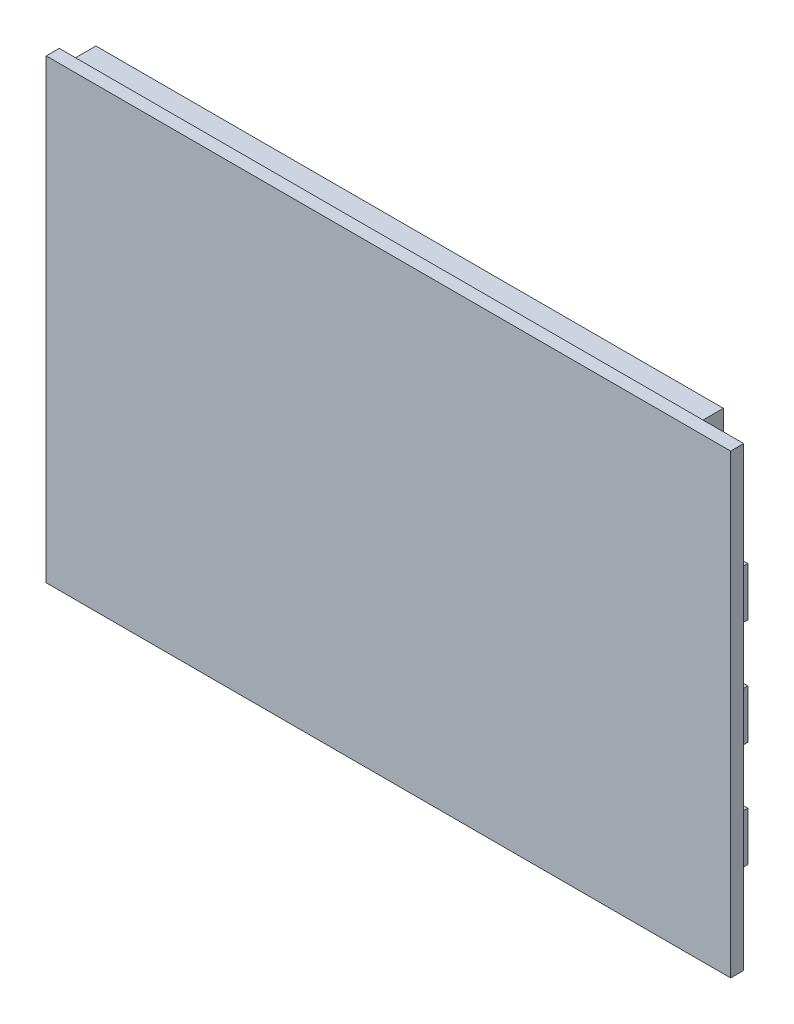
ISO-10303-21;
HEADER;
FILE_DESCRIPTION(('STEP AP214'),'2;1');
FILE_NAME('part.step','',(''),(''),'','','');
FILE_SCHEMA(('AUTOMOTIVE_DESIGN { 1 0 10303 214 1 1 1 1 }'));
ENDSEC;
DATA;
#1=APPLICATION_CONTEXT('core data for automotive mechanical design processes');
#2=APPLICATION_PROTOCOL_DEFINITION('international standard','automotive_design',2000,#1);
#3=PRODUCT_CONTEXT('',#1,'mechanical');
#4=PRODUCT('Part','Part','',(#3));
#5=PRODUCT_RELATED_PRODUCT_CATEGORY('part','',(#4));
#6=PRODUCT_DEFINITION_FORMATION('','',#4);
#7=PRODUCT_DEFINITION_CONTEXT('part definition',#1,'design');
#8=PRODUCT_DEFINITION('design','',#6,#7);
#9=PRODUCT_DEFINITION_SHAPE('','',#8);
#10=(LENGTH_UNIT() NAMED_UNIT(*) SI_UNIT(.MILLI.,.METRE.));
#11=(NAMED_UNIT(*) PLANE_ANGLE_UNIT() SI_UNIT($,.RADIAN.));
#12=(NAMED_UNIT(*) SI_UNIT($,.STERADIAN.) SOLID_ANGLE_UNIT());
#13=UNCERTAINTY_MEASURE_WITH_UNIT(LENGTH_MEASURE(1.E-05),#10,'distance_accuracy_value','');
#14=(GEOMETRIC_REPRESENTATION_CONTEXT(3) GLOBAL_UNCERTAINTY_ASSIGNED_CONTEXT((#13)) GLOBAL_UNIT_ASSIGNED_CONTEXT((#10,
#11,#12)) REPRESENTATION_CONTEXT('',''));
#15=CARTESIAN_POINT('',(0.,0.,0.));
#16=DIRECTION('',(0.,0.,1.));
#17=DIRECTION('',(1.,0.,0.));
#18=AXIS2_PLACEMENT_3D('',#15,#16,#17);
#19=CARTESIAN_POINT('',(0.,0.,0.));
#20=DIRECTION('',(0.,0.,1.));
#21=DIRECTION('',(1.,0.,0.));
#22=AXIS2_PLACEMENT_3D('',#19,#20,#21);
#23=PLANE('',#22);
#24=DIRECTION('',(0.,1.,0.));
#25=VECTOR('',#24,1.);
#26=CARTESIAN_POINT('',(79.,36.,0.));
#27=LINE('',#26,#25);
#28=CARTESIAN_POINT('',(79.,36.,0.));
#29=VERTEX_POINT('',#28);
#30=CARTESIAN_POINT('',(79.,42.,0.));
#31=VERTEX_POINT('',#30);
#32=EDGE_CURVE('E192',#29,#31,#27,.T.);
#33=ORIENTED_EDGE('',*,*,#32,.F.);
#34=DIRECTION('',(-1.,0.,0.));
#35=VECTOR('',#34,1.);
#36=CARTESIAN_POINT('',(79.,36.,0.));
#37=LINE('',#36,#35);
#38=CARTESIAN_POINT('',(83.,36.,0.));
#39=VERTEX_POINT('',#38);
#40=EDGE_CURVE('E205',#39,#29,#37,.T.);
#41=ORIENTED_EDGE('',*,*,#40,.F.);
#42=DIRECTION('',(0.,-1.,0.));
#43=VECTOR('',#42,1.);
#44=CARTESIAN_POINT('',(83.,36.,0.));
#45=LINE('',#44,#43);
#46=CARTESIAN_POINT('',(83.,42.,0.));
#47=VERTEX_POINT('',#46);
#48=EDGE_CURVE('E214',#47,#39,#45,.T.);
#49=ORIENTED_EDGE('',*,*,#48,.F.);
#50=DIRECTION('',(1.,0.,0.));
#51=VECTOR('',#50,1.);
#52=CARTESIAN_POINT('',(79.,42.,0.));
#53=LINE('',#52,#51);
#54=EDGE_CURVE('E195',#31,#47,#53,.T.);
#55=ORIENTED_EDGE('',*,*,#54,.F.);
#56=EDGE_LOOP('',(#33,#41,#49,#55));
#57=FACE_BOUND('',#56,.T.);
#58=DIRECTION('',(0.,-1.,0.));
#59=VECTOR('',#58,1.);
#60=CARTESIAN_POINT('',(78.,55.,0.));
#61=LINE('',#60,#59);
#62=CARTESIAN_POINT('',(78.,55.,0.));
#63=VERTEX_POINT('',#62);
#64=CARTESIAN_POINT('',(78.,1.,0.));
#65=VERTEX_POINT('',#64);
#66=EDGE_CURVE('E262',#63,#65,#61,.T.);
#67=ORIENTED_EDGE('',*,*,#66,.F.);
#68=DIRECTION('',(1.,0.,0.));
#69=VECTOR('',#68,1.);
#70=CARTESIAN_POINT('',(78.,55.,0.));
#71=LINE('',#70,#69);
#72=CARTESIAN_POINT('',(1.,55.,0.));
#73=VERTEX_POINT('',#72);
#74=EDGE_CURVE('E267',#73,#63,#71,.T.);
#75=ORIENTED_EDGE('',*,*,#74,.F.);
#76=DIRECTION('',(0.,1.,0.));
#77=VECTOR('',#76,1.);
#78=CARTESIAN_POINT('',(1.,55.,0.));
#79=LINE('',#78,#77);
#80=CARTESIAN_POINT('',(1.,1.,0.));
#81=VERTEX_POINT('',#80);
#82=EDGE_CURVE('E279',#81,#73,#79,.T.);
#83=ORIENTED_EDGE('',*,*,#82,.F.);
#84=DIRECTION('',(-1.,0.,0.));
#85=VECTOR('',#84,1.);
#86=CARTESIAN_POINT('',(78.,1.,0.));
#87=LINE('',#86,#85);
#88=EDGE_CURVE('E276',#65,#81,#87,.T.);
#89=ORIENTED_EDGE('',*,*,#88,.F.);
#90=EDGE_LOOP('',(#67,#75,#83,#89));
#91=FACE_BOUND('',#90,.T.);
#92=DIRECTION('',(1.,0.,0.));
#93=VECTOR('',#92,1.);
#94=CARTESIAN_POINT('',(0.,56.,0.));
#95=LINE('',#94,#93);
#96=CARTESIAN_POINT('',(0.,56.,0.));
#97=VERTEX_POINT('',#96);
#98=CARTESIAN_POINT('',(84.,56.,0.));
#99=VERTEX_POINT('',#98);
#100=EDGE_CURVE('E295',#97,#99,#95,.T.);
#101=ORIENTED_EDGE('',*,*,#100,.T.);
#102=DIRECTION('',(0.,1.,0.));
#103=VECTOR('',#102,1.);
#104=CARTESIAN_POINT('',(84.,0.,0.));
#105=LINE('',#104,#103);
#106=CARTESIAN_POINT('',(84.,0.,0.));
#107=VERTEX_POINT('',#106);
#108=EDGE_CURVE('E309',#107,#99,#105,.T.);
#109=ORIENTED_EDGE('',*,*,#108,.F.);
#110=DIRECTION('',(1.,0.,0.));
#111=VECTOR('',#110,1.);
#112=CARTESIAN_POINT('',(0.,0.,0.));
#113=LINE('',#112,#111);
#114=CARTESIAN_POINT('',(0.,0.,0.));
#115=VERTEX_POINT('',#114);
#116=EDGE_CURVE('E312',#115,#107,#113,.T.);
#117=ORIENTED_EDGE('',*,*,#116,.F.);
#118=DIRECTION('',(0.,1.,0.));
#119=VECTOR('',#118,1.);
#120=CARTESIAN_POINT('',(0.,0.,0.));
#121=LINE('',#120,#119);
#122=EDGE_CURVE('E300',#115,#97,#121,.T.);
#123=ORIENTED_EDGE('',*,*,#122,.T.);
#124=EDGE_LOOP('',(#101,#109,#117,#123));
#125=FACE_BOUND('',#124,.T.);
#126=DIRECTION('',(0.,-1.,0.));
#127=VECTOR('',#126,1.);
#128=CARTESIAN_POINT('',(83.,29.,0.));
#129=LINE('',#128,#127);
#130=CARTESIAN_POINT('',(83.,29.,0.));
#131=VERTEX_POINT('',#130);
#132=CARTESIAN_POINT('',(83.,23.,0.));
#133=VERTEX_POINT('',#132);
#134=EDGE_CURVE('E230',#131,#133,#129,.T.);
#135=ORIENTED_EDGE('',*,*,#134,.F.);
#136=DIRECTION('',(-1.,0.,0.));
#137=VECTOR('',#136,1.);
#138=CARTESIAN_POINT('',(83.,29.,0.));
#139=LINE('',#138,#137);
#140=CARTESIAN_POINT('',(79.,29.,0.));
#141=VERTEX_POINT('',#140);
#142=EDGE_CURVE('E235',#131,#141,#139,.T.);
#143=ORIENTED_EDGE('',*,*,#142,.T.);
#144=DIRECTION('',(0.,-1.,0.));
#145=VECTOR('',#144,1.);
#146=CARTESIAN_POINT('',(79.,29.,0.));
#147=LINE('',#146,#145);
#148=CARTESIAN_POINT('',(79.,23.,0.));
#149=VERTEX_POINT('',#148);
#150=EDGE_CURVE('E249',#141,#149,#147,.T.);
#151=ORIENTED_EDGE('',*,*,#150,.T.);
#152=DIRECTION('',(-1.,0.,0.));
#153=VECTOR('',#152,1.);
#154=CARTESIAN_POINT('',(83.,23.,0.));
#155=LINE('',#154,#153);
#156=EDGE_CURVE('E246',#133,#149,#155,.T.);
#157=ORIENTED_EDGE('',*,*,#156,.F.);
#158=EDGE_LOOP('',(#135,#143,#151,#157));
#159=FACE_BOUND('',#158,.T.);
#160=DIRECTION('',(0.,-1.,0.));
#161=VECTOR('',#160,1.);
#162=CARTESIAN_POINT('',(83.,10.,0.));
#163=LINE('',#162,#161);
#164=CARTESIAN_POINT('',(83.,16.,0.));
#165=VERTEX_POINT('',#164);
#166=CARTESIAN_POINT('',(83.,10.,0.));
#167=VERTEX_POINT('',#166);
#168=EDGE_CURVE('E191',#165,#167,#163,.T.);
#169=ORIENTED_EDGE('',*,*,#168,.F.);
#170=DIRECTION('',(1.,0.,0.));
#171=VECTOR('',#170,1.);
#172=CARTESIAN_POINT('',(83.,16.,0.));
#173=LINE('',#172,#171);
#174=CARTESIAN_POINT('',(79.,16.,0.));
#175=VERTEX_POINT('',#174);
#176=EDGE_CURVE('E188',#175,#165,#173,.T.);
#177=ORIENTED_EDGE('',*,*,#176,.F.);
#178=DIRECTION('',(0.,1.,0.));
#179=VECTOR('',#178,1.);
#180=CARTESIAN_POINT('',(79.,10.,0.));
#181=LINE('',#180,#179);
#182=CARTESIAN_POINT('',(79.,10.,0.));
#183=VERTEX_POINT('',#182);
#184=EDGE_CURVE('E55',#183,#175,#181,.T.);
#185=ORIENTED_EDGE('',*,*,#184,.F.);
#186=DIRECTION('',(-1.,0.,0.));
#187=VECTOR('',#186,1.);
#188=CARTESIAN_POINT('',(83.,10.,0.));
#189=LINE('',#188,#187);
#190=EDGE_CURVE('E50',#167,#183,#189,.T.);
#191=ORIENTED_EDGE('',*,*,#190,.F.);
#192=EDGE_LOOP('',(#169,#177,#185,#191));
#193=FACE_BOUND('',#192,.T.);
#194=ADVANCED_FACE('F33',(#57,#91,#125,#159,#193),#23,.F.);
#195=CARTESIAN_POINT('',(0.,56.,1.6));
#196=DIRECTION('',(0.,1.,0.));
#197=DIRECTION('',(0.,0.,1.));
#198=AXIS2_PLACEMENT_3D('',#195,#196,#197);
#199=PLANE('',#198);
#200=ORIENTED_EDGE('',*,*,#100,.F.);
#201=DIRECTION('',(0.,0.,-1.));
#202=VECTOR('',#201,1.);
#203=CARTESIAN_POINT('',(0.,56.,1.6));
#204=LINE('',#203,#202);
#205=CARTESIAN_POINT('',(0.,56.,1.6));
#206=VERTEX_POINT('',#205);
#207=EDGE_CURVE('E11',#206,#97,#204,.T.);
#208=ORIENTED_EDGE('',*,*,#207,.F.);
#209=DIRECTION('',(1.,0.,0.));
#210=VECTOR('',#209,1.);
#211=CARTESIAN_POINT('',(0.,56.,1.6));
#212=LINE('',#211,#210);
#213=CARTESIAN_POINT('',(84.,56.,1.6));
#214=VERTEX_POINT('',#213);
#215=EDGE_CURVE('E296',#206,#214,#212,.T.);
#216=ORIENTED_EDGE('',*,*,#215,.T.);
#217=DIRECTION('',(0.,0.,-1.));
#218=VECTOR('',#217,1.);
#219=CARTESIAN_POINT('',(84.,56.,1.6));
#220=LINE('',#219,#218);
#221=EDGE_CURVE('E37',#214,#99,#220,.T.);
#222=ORIENTED_EDGE('',*,*,#221,.T.);
#223=EDGE_LOOP('',(#200,#208,#216,#222));
#224=FACE_BOUND('',#223,.T.);
#225=ADVANCED_FACE('F35',(#224),#199,.T.);
#226=CARTESIAN_POINT('',(0.,0.,1.6));
#227=DIRECTION('',(-1.,0.,0.));
#228=DIRECTION('',(0.,0.,1.));
#229=AXIS2_PLACEMENT_3D('',#226,#227,#228);
#230=PLANE('',#229);
#231=ORIENTED_EDGE('',*,*,#122,.F.);
#232=DIRECTION('',(0.,0.,-1.));
#233=VECTOR('',#232,1.);
#234=CARTESIAN_POINT('',(0.,0.,1.6));
#235=LINE('',#234,#233);
#236=CARTESIAN_POINT('',(0.,0.,1.6));
#237=VERTEX_POINT('',#236);
#238=EDGE_CURVE('E42',#237,#115,#235,.T.);
#239=ORIENTED_EDGE('',*,*,#238,.F.);
#240=DIRECTION('',(0.,1.,0.));
#241=VECTOR('',#240,1.);
#242=CARTESIAN_POINT('',(0.,0.,1.6));
#243=LINE('',#242,#241);
#244=EDGE_CURVE('E304',#237,#206,#243,.T.);
#245=ORIENTED_EDGE('',*,*,#244,.T.);
#246=ORIENTED_EDGE('',*,*,#207,.T.);
#247=EDGE_LOOP('',(#231,#239,#245,#246));
#248=FACE_BOUND('',#247,.T.);
#249=ADVANCED_FACE('F332',(#248),#230,.T.);
#250=CARTESIAN_POINT('',(0.,0.,1.6));
#251=DIRECTION('',(0.,1.,0.));
#252=DIRECTION('',(0.,0.,1.));
#253=AXIS2_PLACEMENT_3D('',#250,#251,#252);
#254=PLANE('',#253);
#255=ORIENTED_EDGE('',*,*,#116,.T.);
#256=DIRECTION('',(0.,0.,-1.));
#257=VECTOR('',#256,1.);
#258=CARTESIAN_POINT('',(84.,0.,1.6));
#259=LINE('',#258,#257);
#260=CARTESIAN_POINT('',(84.,0.,1.6));
#261=VERTEX_POINT('',#260);
#262=EDGE_CURVE('E316',#261,#107,#259,.T.);
#263=ORIENTED_EDGE('',*,*,#262,.F.);
#264=DIRECTION('',(1.,0.,0.));
#265=VECTOR('',#264,1.);
#266=CARTESIAN_POINT('',(0.,0.,1.6));
#267=LINE('',#266,#265);
#268=EDGE_CURVE('E302',#237,#261,#267,.T.);
#269=ORIENTED_EDGE('',*,*,#268,.F.);
#270=ORIENTED_EDGE('',*,*,#238,.T.);
#271=EDGE_LOOP('',(#255,#263,#269,#270));
#272=FACE_BOUND('',#271,.T.);
#273=ADVANCED_FACE('F338',(#272),#254,.F.);
#274=CARTESIAN_POINT('',(84.,0.,1.6));
#275=DIRECTION('',(-1.,0.,0.));
#276=DIRECTION('',(0.,0.,1.));
#277=AXIS2_PLACEMENT_3D('',#274,#275,#276);
#278=PLANE('',#277);
#279=ORIENTED_EDGE('',*,*,#108,.T.);
#280=ORIENTED_EDGE('',*,*,#221,.F.);
#281=DIRECTION('',(0.,1.,0.));
#282=VECTOR('',#281,1.);
#283=CARTESIAN_POINT('',(84.,0.,1.6));
#284=LINE('',#283,#282);
#285=EDGE_CURVE('E299',#261,#214,#284,.T.);
#286=ORIENTED_EDGE('',*,*,#285,.F.);
#287=ORIENTED_EDGE('',*,*,#262,.T.);
#288=EDGE_LOOP('',(#279,#280,#286,#287));
#289=FACE_BOUND('',#288,.T.);
#290=ADVANCED_FACE('F326',(#289),#278,.F.);
#291=CARTESIAN_POINT('',(0.,0.,1.6));
#292=DIRECTION('',(0.,0.,1.));
#293=DIRECTION('',(1.,0.,0.));
#294=AXIS2_PLACEMENT_3D('',#291,#292,#293);
#295=PLANE('',#294);
#296=ORIENTED_EDGE('',*,*,#215,.F.);
#297=ORIENTED_EDGE('',*,*,#244,.F.);
#298=ORIENTED_EDGE('',*,*,#268,.T.);
#299=ORIENTED_EDGE('',*,*,#285,.T.);
#300=EDGE_LOOP('',(#296,#297,#298,#299));
#301=FACE_BOUND('',#300,.T.);
#302=ADVANCED_FACE('F336',(#301),#295,.T.);
#303=CARTESIAN_POINT('',(78.,55.,-3.5));
#304=DIRECTION('',(-1.,0.,0.));
#305=DIRECTION('',(0.,-1.,0.));
#306=AXIS2_PLACEMENT_3D('',#303,#304,#305);
#307=PLANE('',#306);
#308=ORIENTED_EDGE('',*,*,#66,.T.);
#309=DIRECTION('',(0.,0.,1.));
#310=VECTOR('',#309,1.);
#311=CARTESIAN_POINT('',(78.,1.,-3.5));
#312=LINE('',#311,#310);
#313=CARTESIAN_POINT('',(78.,1.,-3.5));
#314=VERTEX_POINT('',#313);
#315=EDGE_CURVE('E292',#314,#65,#312,.T.);
#316=ORIENTED_EDGE('',*,*,#315,.F.);
#317=DIRECTION('',(0.,-1.,0.));
#318=VECTOR('',#317,1.);
#319=CARTESIAN_POINT('',(78.,55.,-3.5));
#320=LINE('',#319,#318);
#321=CARTESIAN_POINT('',(78.,55.,-3.5));
#322=VERTEX_POINT('',#321);
#323=EDGE_CURVE('E263',#322,#314,#320,.T.);
#324=ORIENTED_EDGE('',*,*,#323,.F.);
#325=DIRECTION('',(0.,0.,1.));
#326=VECTOR('',#325,1.);
#327=CARTESIAN_POINT('',(78.,55.,-3.5));
#328=LINE('',#327,#326);
#329=EDGE_CURVE('E273',#322,#63,#328,.T.);
#330=ORIENTED_EDGE('',*,*,#329,.T.);
#331=EDGE_LOOP('',(#308,#316,#324,#330));
#332=FACE_BOUND('',#331,.T.);
#333=ADVANCED_FACE('F356',(#332),#307,.F.);
#334=CARTESIAN_POINT('',(78.,1.,-3.5));
#335=DIRECTION('',(0.,1.,0.));
#336=DIRECTION('',(0.,0.,1.));
#337=AXIS2_PLACEMENT_3D('',#334,#335,#336);
#338=PLANE('',#337);
#339=ORIENTED_EDGE('',*,*,#88,.T.);
#340=DIRECTION('',(0.,0.,1.));
#341=VECTOR('',#340,1.);
#342=CARTESIAN_POINT('',(1.,1.,-3.5));
#343=LINE('',#342,#341);
#344=CARTESIAN_POINT('',(1.,1.,-3.5));
#345=VERTEX_POINT('',#344);
#346=EDGE_CURVE('E289',#345,#81,#343,.T.);
#347=ORIENTED_EDGE('',*,*,#346,.F.);
#348=DIRECTION('',(-1.,0.,0.));
#349=VECTOR('',#348,1.);
#350=CARTESIAN_POINT('',(78.,1.,-3.5));
#351=LINE('',#350,#349);
#352=EDGE_CURVE('E266',#314,#345,#351,.T.);
#353=ORIENTED_EDGE('',*,*,#352,.F.);
#354=ORIENTED_EDGE('',*,*,#315,.T.);
#355=EDGE_LOOP('',(#339,#347,#353,#354));
#356=FACE_BOUND('',#355,.T.);
#357=ADVANCED_FACE('F359',(#356),#338,.F.);
#358=CARTESIAN_POINT('',(1.,55.,-3.5));
#359=DIRECTION('',(1.,0.,0.));
#360=DIRECTION('',(0.,0.,-1.));
#361=AXIS2_PLACEMENT_3D('',#358,#359,#360);
#362=PLANE('',#361);
#363=ORIENTED_EDGE('',*,*,#82,.T.);
#364=DIRECTION('',(0.,0.,1.));
#365=VECTOR('',#364,1.);
#366=CARTESIAN_POINT('',(1.,55.,-3.5));
#367=LINE('',#366,#365);
#368=CARTESIAN_POINT('',(1.,55.,-3.5));
#369=VERTEX_POINT('',#368);
#370=EDGE_CURVE('E286',#369,#73,#367,.T.);
#371=ORIENTED_EDGE('',*,*,#370,.F.);
#372=DIRECTION('',(0.,1.,0.));
#373=VECTOR('',#372,1.);
#374=CARTESIAN_POINT('',(1.,55.,-3.5));
#375=LINE('',#374,#373);
#376=EDGE_CURVE('E269',#345,#369,#375,.T.);
#377=ORIENTED_EDGE('',*,*,#376,.F.);
#378=ORIENTED_EDGE('',*,*,#346,.T.);
#379=EDGE_LOOP('',(#363,#371,#377,#378));
#380=FACE_BOUND('',#379,.T.);
#381=ADVANCED_FACE('F363',(#380),#362,.F.);
#382=CARTESIAN_POINT('',(78.,55.,-3.5));
#383=DIRECTION('',(0.,-1.,0.));
#384=DIRECTION('',(0.,0.,-1.));
#385=AXIS2_PLACEMENT_3D('',#382,#383,#384);
#386=PLANE('',#385);
#387=ORIENTED_EDGE('',*,*,#74,.T.);
#388=ORIENTED_EDGE('',*,*,#329,.F.);
#389=DIRECTION('',(1.,0.,0.));
#390=VECTOR('',#389,1.);
#391=CARTESIAN_POINT('',(78.,55.,-3.5));
#392=LINE('',#391,#390);
#393=EDGE_CURVE('E271',#369,#322,#392,.T.);
#394=ORIENTED_EDGE('',*,*,#393,.F.);
#395=ORIENTED_EDGE('',*,*,#370,.T.);
#396=EDGE_LOOP('',(#387,#388,#394,#395));
#397=FACE_BOUND('',#396,.T.);
#398=ADVANCED_FACE('F367',(#397),#386,.F.);
#399=CARTESIAN_POINT('',(0.,0.,-3.5));
#400=DIRECTION('',(0.,0.,-1.));
#401=DIRECTION('',(-1.,0.,0.));
#402=AXIS2_PLACEMENT_3D('',#399,#400,#401);
#403=PLANE('',#402);
#404=ORIENTED_EDGE('',*,*,#323,.T.);
#405=ORIENTED_EDGE('',*,*,#352,.T.);
#406=ORIENTED_EDGE('',*,*,#376,.T.);
#407=ORIENTED_EDGE('',*,*,#393,.T.);
#408=EDGE_LOOP('',(#404,#405,#406,#407));
#409=FACE_BOUND('',#408,.T.);
#410=ADVANCED_FACE('F371',(#409),#403,.T.);
#411=CARTESIAN_POINT('',(83.,29.,-1.5));
#412=DIRECTION('',(-1.,0.,0.));
#413=DIRECTION('',(0.,0.,1.));
#414=AXIS2_PLACEMENT_3D('',#411,#412,#413);
#415=PLANE('',#414);
#416=ORIENTED_EDGE('',*,*,#134,.T.);
#417=DIRECTION('',(0.,0.,1.));
#418=VECTOR('',#417,1.);
#419=CARTESIAN_POINT('',(83.,23.,-1.5));
#420=LINE('',#419,#418);
#421=CARTESIAN_POINT('',(83.,23.,-1.5));
#422=VERTEX_POINT('',#421);
#423=EDGE_CURVE('E260',#422,#133,#420,.T.);
#424=ORIENTED_EDGE('',*,*,#423,.F.);
#425=DIRECTION('',(0.,-1.,0.));
#426=VECTOR('',#425,1.);
#427=CARTESIAN_POINT('',(83.,29.,-1.5));
#428=LINE('',#427,#426);
#429=CARTESIAN_POINT('',(83.,29.,-1.5));
#430=VERTEX_POINT('',#429);
#431=EDGE_CURVE('E231',#430,#422,#428,.T.);
#432=ORIENTED_EDGE('',*,*,#431,.F.);
#433=DIRECTION('',(0.,0.,1.));
#434=VECTOR('',#433,1.);
#435=CARTESIAN_POINT('',(83.,29.,-1.5));
#436=LINE('',#435,#434);
#437=EDGE_CURVE('E243',#430,#131,#436,.T.);
#438=ORIENTED_EDGE('',*,*,#437,.T.);
#439=EDGE_LOOP('',(#416,#424,#432,#438));
#440=FACE_BOUND('',#439,.T.);
#441=ADVANCED_FACE('F375',(#440),#415,.F.);
#442=CARTESIAN_POINT('',(83.,23.,-1.5));
#443=DIRECTION('',(0.,1.,0.));
#444=DIRECTION('',(0.,0.,1.));
#445=AXIS2_PLACEMENT_3D('',#442,#443,#444);
#446=PLANE('',#445);
#447=ORIENTED_EDGE('',*,*,#156,.T.);
#448=DIRECTION('',(0.,0.,1.));
#449=VECTOR('',#448,1.);
#450=CARTESIAN_POINT('',(79.,23.,-1.5));
#451=LINE('',#450,#449);
#452=CARTESIAN_POINT('',(79.,23.,-1.5));
#453=VERTEX_POINT('',#452);
#454=EDGE_CURVE('E258',#453,#149,#451,.T.);
#455=ORIENTED_EDGE('',*,*,#454,.F.);
#456=DIRECTION('',(-1.,0.,0.));
#457=VECTOR('',#456,1.);
#458=CARTESIAN_POINT('',(83.,23.,-1.5));
#459=LINE('',#458,#457);
#460=EDGE_CURVE('E234',#422,#453,#459,.T.);
#461=ORIENTED_EDGE('',*,*,#460,.F.);
#462=ORIENTED_EDGE('',*,*,#423,.T.);
#463=EDGE_LOOP('',(#447,#455,#461,#462));
#464=FACE_BOUND('',#463,.T.);
#465=ADVANCED_FACE('F379',(#464),#446,.F.);
#466=CARTESIAN_POINT('',(79.,29.,-1.5));
#467=DIRECTION('',(-1.,0.,0.));
#468=DIRECTION('',(0.,0.,1.));
#469=AXIS2_PLACEMENT_3D('',#466,#467,#468);
#470=PLANE('',#469);
#471=ORIENTED_EDGE('',*,*,#150,.F.);
#472=DIRECTION('',(0.,0.,1.));
#473=VECTOR('',#472,1.);
#474=CARTESIAN_POINT('',(79.,29.,-1.5));
#475=LINE('',#474,#473);
#476=CARTESIAN_POINT('',(79.,29.,-1.5));
#477=VERTEX_POINT('',#476);
#478=EDGE_CURVE('E255',#477,#141,#475,.T.);
#479=ORIENTED_EDGE('',*,*,#478,.F.);
#480=DIRECTION('',(0.,-1.,0.));
#481=VECTOR('',#480,1.);
#482=CARTESIAN_POINT('',(79.,29.,-1.5));
#483=LINE('',#482,#481);
#484=EDGE_CURVE('E237',#477,#453,#483,.T.);
#485=ORIENTED_EDGE('',*,*,#484,.T.);
#486=ORIENTED_EDGE('',*,*,#454,.T.);
#487=EDGE_LOOP('',(#471,#479,#485,#486));
#488=FACE_BOUND('',#487,.T.);
#489=ADVANCED_FACE('F383',(#488),#470,.T.);
#490=CARTESIAN_POINT('',(83.,29.,-1.5));
#491=DIRECTION('',(0.,1.,0.));
#492=DIRECTION('',(0.,0.,1.));
#493=AXIS2_PLACEMENT_3D('',#490,#491,#492);
#494=PLANE('',#493);
#495=ORIENTED_EDGE('',*,*,#142,.F.);
#496=ORIENTED_EDGE('',*,*,#437,.F.);
#497=DIRECTION('',(-1.,0.,0.));
#498=VECTOR('',#497,1.);
#499=CARTESIAN_POINT('',(83.,29.,-1.5));
#500=LINE('',#499,#498);
#501=EDGE_CURVE('E240',#430,#477,#500,.T.);
#502=ORIENTED_EDGE('',*,*,#501,.T.);
#503=ORIENTED_EDGE('',*,*,#478,.T.);
#504=EDGE_LOOP('',(#495,#496,#502,#503));
#505=FACE_BOUND('',#504,.T.);
#506=ADVANCED_FACE('F387',(#505),#494,.T.);
#507=CARTESIAN_POINT('',(0.,0.,-1.5));
#508=DIRECTION('',(0.,0.,-1.));
#509=DIRECTION('',(-1.,0.,0.));
#510=AXIS2_PLACEMENT_3D('',#507,#508,#509);
#511=PLANE('',#510);
#512=ORIENTED_EDGE('',*,*,#431,.T.);
#513=ORIENTED_EDGE('',*,*,#460,.T.);
#514=ORIENTED_EDGE('',*,*,#484,.F.);
#515=ORIENTED_EDGE('',*,*,#501,.F.);
#516=EDGE_LOOP('',(#512,#513,#514,#515));
#517=FACE_BOUND('',#516,.T.);
#518=ADVANCED_FACE('F391',(#517),#511,.T.);
#519=CARTESIAN_POINT('',(79.,36.,-1.5));
#520=DIRECTION('',(1.,0.,0.));
#521=DIRECTION('',(0.,0.,-1.));
#522=AXIS2_PLACEMENT_3D('',#519,#520,#521);
#523=PLANE('',#522);
#524=ORIENTED_EDGE('',*,*,#32,.T.);
#525=DIRECTION('',(0.,0.,1.));
#526=VECTOR('',#525,1.);
#527=CARTESIAN_POINT('',(79.,42.,-1.5));
#528=LINE('',#527,#526);
#529=CARTESIAN_POINT('',(79.,42.,-1.5));
#530=VERTEX_POINT('',#529);
#531=EDGE_CURVE('E227',#530,#31,#528,.T.);
#532=ORIENTED_EDGE('',*,*,#531,.F.);
#533=DIRECTION('',(0.,1.,0.));
#534=VECTOR('',#533,1.);
#535=CARTESIAN_POINT('',(79.,36.,-1.5));
#536=LINE('',#535,#534);
#537=CARTESIAN_POINT('',(79.,36.,-1.5));
#538=VERTEX_POINT('',#537);
#539=EDGE_CURVE('E201',#538,#530,#536,.T.);
#540=ORIENTED_EDGE('',*,*,#539,.F.);
#541=DIRECTION('',(0.,0.,1.));
#542=VECTOR('',#541,1.);
#543=CARTESIAN_POINT('',(79.,36.,-1.5));
#544=LINE('',#543,#542);
#545=EDGE_CURVE('E210',#538,#29,#544,.T.);
#546=ORIENTED_EDGE('',*,*,#545,.T.);
#547=EDGE_LOOP('',(#524,#532,#540,#546));
#548=FACE_BOUND('',#547,.T.);
#549=ADVANCED_FACE('F395',(#548),#523,.F.);
#550=CARTESIAN_POINT('',(79.,42.,-1.5));
#551=DIRECTION('',(0.,-1.,0.));
#552=DIRECTION('',(0.,0.,-1.));
#553=AXIS2_PLACEMENT_3D('',#550,#551,#552);
#554=PLANE('',#553);
#555=ORIENTED_EDGE('',*,*,#54,.T.);
#556=DIRECTION('',(0.,0.,1.));
#557=VECTOR('',#556,1.);
#558=CARTESIAN_POINT('',(83.,42.,-1.5));
#559=LINE('',#558,#557);
#560=CARTESIAN_POINT('',(83.,42.,-1.5));
#561=VERTEX_POINT('',#560);
#562=EDGE_CURVE('E224',#561,#47,#559,.T.);
#563=ORIENTED_EDGE('',*,*,#562,.F.);
#564=DIRECTION('',(1.,0.,0.));
#565=VECTOR('',#564,1.);
#566=CARTESIAN_POINT('',(79.,42.,-1.5));
#567=LINE('',#566,#565);
#568=EDGE_CURVE('E204',#530,#561,#567,.T.);
#569=ORIENTED_EDGE('',*,*,#568,.F.);
#570=ORIENTED_EDGE('',*,*,#531,.T.);
#571=EDGE_LOOP('',(#555,#563,#569,#570));
#572=FACE_BOUND('',#571,.T.);
#573=ADVANCED_FACE('F399',(#572),#554,.F.);
#574=CARTESIAN_POINT('',(83.,36.,-1.5));
#575=DIRECTION('',(-1.,0.,0.));
#576=DIRECTION('',(0.,0.,1.));
#577=AXIS2_PLACEMENT_3D('',#574,#575,#576);
#578=PLANE('',#577);
#579=ORIENTED_EDGE('',*,*,#48,.T.);
#580=DIRECTION('',(0.,0.,1.));
#581=VECTOR('',#580,1.);
#582=CARTESIAN_POINT('',(83.,36.,-1.5));
#583=LINE('',#582,#581);
#584=CARTESIAN_POINT('',(83.,36.,-1.5));
#585=VERTEX_POINT('',#584);
#586=EDGE_CURVE('E221',#585,#39,#583,.T.);
#587=ORIENTED_EDGE('',*,*,#586,.F.);
#588=DIRECTION('',(0.,-1.,0.));
#589=VECTOR('',#588,1.);
#590=CARTESIAN_POINT('',(83.,36.,-1.5));
#591=LINE('',#590,#589);
#592=EDGE_CURVE('E207',#561,#585,#591,.T.);
#593=ORIENTED_EDGE('',*,*,#592,.F.);
#594=ORIENTED_EDGE('',*,*,#562,.T.);
#595=EDGE_LOOP('',(#579,#587,#593,#594));
#596=FACE_BOUND('',#595,.T.);
#597=ADVANCED_FACE('F403',(#596),#578,.F.);
#598=CARTESIAN_POINT('',(79.,36.,-1.5));
#599=DIRECTION('',(0.,1.,0.));
#600=DIRECTION('',(0.,0.,1.));
#601=AXIS2_PLACEMENT_3D('',#598,#599,#600);
#602=PLANE('',#601);
#603=ORIENTED_EDGE('',*,*,#40,.T.);
#604=ORIENTED_EDGE('',*,*,#545,.F.);
#605=DIRECTION('',(-1.,0.,0.));
#606=VECTOR('',#605,1.);
#607=CARTESIAN_POINT('',(79.,36.,-1.5));
#608=LINE('',#607,#606);
#609=EDGE_CURVE('E209',#585,#538,#608,.T.);
#610=ORIENTED_EDGE('',*,*,#609,.F.);
#611=ORIENTED_EDGE('',*,*,#586,.T.);
#612=EDGE_LOOP('',(#603,#604,#610,#611));
#613=FACE_BOUND('',#612,.T.);
#614=ADVANCED_FACE('F407',(#613),#602,.F.);
#615=CARTESIAN_POINT('',(0.,0.,-1.5));
#616=DIRECTION('',(0.,0.,-1.));
#617=DIRECTION('',(-1.,0.,0.));
#618=AXIS2_PLACEMENT_3D('',#615,#616,#617);
#619=PLANE('',#618);
#620=ORIENTED_EDGE('',*,*,#539,.T.);
#621=ORIENTED_EDGE('',*,*,#568,.T.);
#622=ORIENTED_EDGE('',*,*,#592,.T.);
#623=ORIENTED_EDGE('',*,*,#609,.T.);
#624=EDGE_LOOP('',(#620,#621,#622,#623));
#625=FACE_BOUND('',#624,.T.);
#626=ADVANCED_FACE('F411',(#625),#619,.T.);
#627=CARTESIAN_POINT('',(83.,10.,-1.5));
#628=DIRECTION('',(-1.,0.,0.));
#629=DIRECTION('',(0.,0.,1.));
#630=AXIS2_PLACEMENT_3D('',#627,#628,#629);
#631=PLANE('',#630);
#632=ORIENTED_EDGE('',*,*,#168,.T.);
#633=DIRECTION('',(0.,0.,1.));
#634=VECTOR('',#633,1.);
#635=CARTESIAN_POINT('',(83.,10.,-1.5));
#636=LINE('',#635,#634);
#637=CARTESIAN_POINT('',(83.,10.,-1.5));
#638=VERTEX_POINT('',#637);
#639=EDGE_CURVE('E172',#638,#167,#636,.T.);
#640=ORIENTED_EDGE('',*,*,#639,.F.);
#641=DIRECTION('',(0.,-1.,0.));
#642=VECTOR('',#641,1.);
#643=CARTESIAN_POINT('',(83.,10.,-1.5));
#644=LINE('',#643,#642);
#645=CARTESIAN_POINT('',(83.,16.,-1.5));
#646=VERTEX_POINT('',#645);
#647=EDGE_CURVE('E179',#646,#638,#644,.T.);
#648=ORIENTED_EDGE('',*,*,#647,.F.);
#649=DIRECTION('',(0.,0.,1.));
#650=VECTOR('',#649,1.);
#651=CARTESIAN_POINT('',(83.,16.,-1.5));
#652=LINE('',#651,#650);
#653=EDGE_CURVE('E583',#646,#165,#652,.T.);
#654=ORIENTED_EDGE('',*,*,#653,.T.);
#655=EDGE_LOOP('',(#632,#640,#648,#654));
#656=FACE_BOUND('',#655,.T.);
#657=ADVANCED_FACE('F190',(#656),#631,.F.);
#658=CARTESIAN_POINT('',(83.,10.,-1.5));
#659=DIRECTION('',(0.,1.,0.));
#660=DIRECTION('',(0.,0.,1.));
#661=AXIS2_PLACEMENT_3D('',#658,#659,#660);
#662=PLANE('',#661);
#663=ORIENTED_EDGE('',*,*,#190,.T.);
#664=DIRECTION('',(0.,0.,1.));
#665=VECTOR('',#664,1.);
#666=CARTESIAN_POINT('',(79.,10.,-1.5));
#667=LINE('',#666,#665);
#668=CARTESIAN_POINT('',(79.,10.,-1.5));
#669=VERTEX_POINT('',#668);
#670=EDGE_CURVE('E175',#669,#183,#667,.T.);
#671=ORIENTED_EDGE('',*,*,#670,.F.);
#672=DIRECTION('',(-1.,0.,0.));
#673=VECTOR('',#672,1.);
#674=CARTESIAN_POINT('',(83.,10.,-1.5));
#675=LINE('',#674,#673);
#676=EDGE_CURVE('E168',#638,#669,#675,.T.);
#677=ORIENTED_EDGE('',*,*,#676,.F.);
#678=ORIENTED_EDGE('',*,*,#639,.T.);
#679=EDGE_LOOP('',(#663,#671,#677,#678));
#680=FACE_BOUND('',#679,.T.);
#681=ADVANCED_FACE('F170',(#680),#662,.F.);
#682=CARTESIAN_POINT('',(79.,10.,-1.5));
#683=DIRECTION('',(1.,0.,0.));
#684=DIRECTION('',(0.,0.,-1.));
#685=AXIS2_PLACEMENT_3D('',#682,#683,#684);
#686=PLANE('',#685);
#687=ORIENTED_EDGE('',*,*,#184,.T.);
#688=DIRECTION('',(0.,0.,1.));
#689=VECTOR('',#688,1.);
#690=CARTESIAN_POINT('',(79.,16.,-1.5));
#691=LINE('',#690,#689);
#692=CARTESIAN_POINT('',(79.,16.,-1.5));
#693=VERTEX_POINT('',#692);
#694=EDGE_CURVE('E197',#693,#175,#691,.T.);
#695=ORIENTED_EDGE('',*,*,#694,.F.);
#696=DIRECTION('',(0.,1.,0.));
#697=VECTOR('',#696,1.);
#698=CARTESIAN_POINT('',(79.,10.,-1.5));
#699=LINE('',#698,#697);
#700=EDGE_CURVE('E178',#669,#693,#699,.T.);
#701=ORIENTED_EDGE('',*,*,#700,.F.);
#702=ORIENTED_EDGE('',*,*,#670,.T.);
#703=EDGE_LOOP('',(#687,#695,#701,#702));
#704=FACE_BOUND('',#703,.T.);
#705=ADVANCED_FACE('F420',(#704),#686,.F.);
#706=CARTESIAN_POINT('',(83.,16.,-1.5));
#707=DIRECTION('',(0.,-1.,0.));
#708=DIRECTION('',(0.,0.,-1.));
#709=AXIS2_PLACEMENT_3D('',#706,#707,#708);
#710=PLANE('',#709);
#711=ORIENTED_EDGE('',*,*,#176,.T.);
#712=ORIENTED_EDGE('',*,*,#653,.F.);
#713=DIRECTION('',(1.,0.,0.));
#714=VECTOR('',#713,1.);
#715=CARTESIAN_POINT('',(83.,16.,-1.5));
#716=LINE('',#715,#714);
#717=EDGE_CURVE('E184',#693,#646,#716,.T.);
#718=ORIENTED_EDGE('',*,*,#717,.F.);
#719=ORIENTED_EDGE('',*,*,#694,.T.);
#720=EDGE_LOOP('',(#711,#712,#718,#719));
#721=FACE_BOUND('',#720,.T.);
#722=ADVANCED_FACE('F423',(#721),#710,.F.);
#723=CARTESIAN_POINT('',(0.,0.,-1.5));
#724=DIRECTION('',(0.,0.,1.));
#725=DIRECTION('',(1.,0.,0.));
#726=AXIS2_PLACEMENT_3D('',#723,#724,#725);
#727=PLANE('',#726);
#728=ORIENTED_EDGE('',*,*,#647,.T.);
#729=ORIENTED_EDGE('',*,*,#676,.T.);
#730=ORIENTED_EDGE('',*,*,#700,.T.);
#731=ORIENTED_EDGE('',*,*,#717,.T.);
#732=EDGE_LOOP('',(#728,#729,#730,#731));
#733=FACE_BOUND('',#732,.T.);
#734=ADVANCED_FACE('F182',(#733),#727,.F.);
#735=CLOSED_SHELL('',(#194,#225,#249,#273,#290,#302,#333,#357,#381,#398,#410,#441,#465,#489,
#506,#518,#549,#573,#597,#614,#626,#657,#681,#705,#722,#734));
#736=MANIFOLD_SOLID_BREP('B2',#735);
#737=ADVANCED_BREP_SHAPE_REPRESENTATION('',(#18,#736),#14);
#738=SHAPE_DEFINITION_REPRESENTATION(#9,#737);
ENDSEC;
END-ISO-10303-21;
